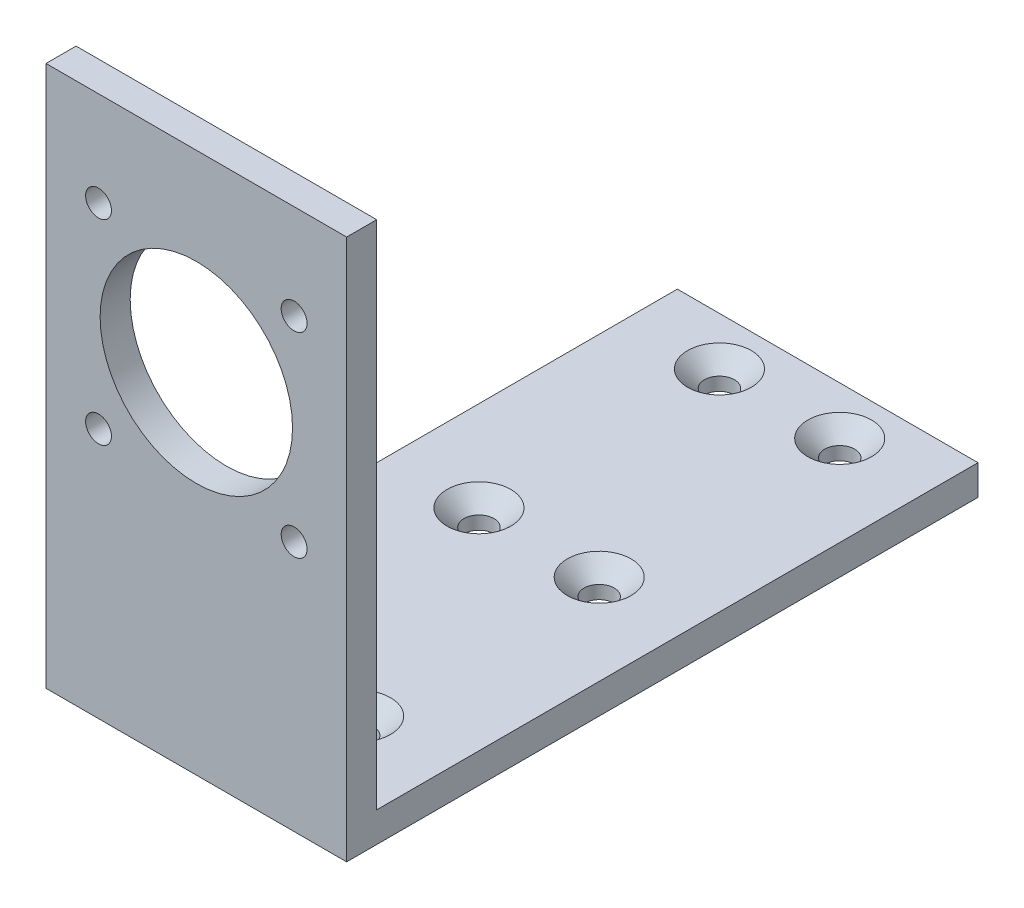
ISO-10303-21;
HEADER;
FILE_DESCRIPTION(('STEP AP214'),'2;1');
FILE_NAME('part.step','',(''),(''),'','','');
FILE_SCHEMA(('AUTOMOTIVE_DESIGN { 1 0 10303 214 1 1 1 1 }'));
ENDSEC;
DATA;
#1=APPLICATION_CONTEXT('core data for automotive mechanical design processes');
#2=APPLICATION_PROTOCOL_DEFINITION('international standard','automotive_design',2000,#1);
#3=PRODUCT_CONTEXT('',#1,'mechanical');
#4=PRODUCT('Part','Part','',(#3));
#5=PRODUCT_RELATED_PRODUCT_CATEGORY('part','',(#4));
#6=PRODUCT_DEFINITION_FORMATION('','',#4);
#7=PRODUCT_DEFINITION_CONTEXT('part definition',#1,'design');
#8=PRODUCT_DEFINITION('design','',#6,#7);
#9=PRODUCT_DEFINITION_SHAPE('','',#8);
#10=(LENGTH_UNIT() NAMED_UNIT(*) SI_UNIT(.MILLI.,.METRE.));
#11=(NAMED_UNIT(*) PLANE_ANGLE_UNIT() SI_UNIT($,.RADIAN.));
#12=(NAMED_UNIT(*) SI_UNIT($,.STERADIAN.) SOLID_ANGLE_UNIT());
#13=UNCERTAINTY_MEASURE_WITH_UNIT(LENGTH_MEASURE(1.E-05),#10,'distance_accuracy_value','');
#14=(GEOMETRIC_REPRESENTATION_CONTEXT(3) GLOBAL_UNCERTAINTY_ASSIGNED_CONTEXT((#13)) GLOBAL_UNIT_ASSIGNED_CONTEXT((#10,
#11,#12)) REPRESENTATION_CONTEXT('',''));
#15=CARTESIAN_POINT('',(0.,0.,0.));
#16=DIRECTION('',(0.,0.,1.));
#17=DIRECTION('',(1.,0.,0.));
#18=AXIS2_PLACEMENT_3D('',#15,#16,#17);
#19=CARTESIAN_POINT('',(0.,0.,0.));
#20=DIRECTION('',(0.,0.,1.));
#21=DIRECTION('',(1.,0.,0.));
#22=AXIS2_PLACEMENT_3D('',#19,#20,#21);
#23=PLANE('',#22);
#24=CARTESIAN_POINT('',(-16.2634559672906,-3.26345596729062,0.));
#25=DIRECTION('',(0.,0.,1.));
#26=DIRECTION('',(1.,0.,0.));
#27=AXIS2_PLACEMENT_3D('',#24,#25,#26);
#28=CIRCLE('',#27,2.15);
#29=CARTESIAN_POINT('',(-14.1134559672906,-3.26345596729062,0.));
#30=VERTEX_POINT('',#29);
#31=EDGE_CURVE('E144',#30,#30,#28,.T.);
#32=ORIENTED_EDGE('',*,*,#31,.T.);
#33=EDGE_LOOP('',(#32));
#34=FACE_BOUND('',#33,.T.);
#35=CARTESIAN_POINT('',(16.2634559672906,29.2634559672906,0.));
#36=DIRECTION('',(0.,0.,1.));
#37=DIRECTION('',(1.,0.,0.));
#38=AXIS2_PLACEMENT_3D('',#35,#36,#37);
#39=CIRCLE('',#38,2.15);
#40=CARTESIAN_POINT('',(18.4134559672906,29.2634559672906,0.));
#41=VERTEX_POINT('',#40);
#42=EDGE_CURVE('E349',#41,#41,#39,.T.);
#43=ORIENTED_EDGE('',*,*,#42,.T.);
#44=EDGE_LOOP('',(#43));
#45=FACE_BOUND('',#44,.T.);
#46=CARTESIAN_POINT('',(0.,13.,0.));
#47=DIRECTION('',(0.,0.,1.));
#48=DIRECTION('',(1.,0.,0.));
#49=AXIS2_PLACEMENT_3D('',#46,#47,#48);
#50=CIRCLE('',#49,16.);
#51=CARTESIAN_POINT('',(16.,13.,0.));
#52=VERTEX_POINT('',#51);
#53=EDGE_CURVE('E308',#52,#52,#50,.T.);
#54=ORIENTED_EDGE('',*,*,#53,.T.);
#55=EDGE_LOOP('',(#54));
#56=FACE_BOUND('',#55,.T.);
#57=CARTESIAN_POINT('',(-16.2634559672906,29.2634559672906,0.));
#58=DIRECTION('',(0.,0.,1.));
#59=DIRECTION('',(1.,0.,0.));
#60=AXIS2_PLACEMENT_3D('',#57,#58,#59);
#61=CIRCLE('',#60,2.15);
#62=CARTESIAN_POINT('',(-14.1134559672906,29.2634559672906,0.));
#63=VERTEX_POINT('',#62);
#64=EDGE_CURVE('E315',#63,#63,#61,.T.);
#65=ORIENTED_EDGE('',*,*,#64,.T.);
#66=EDGE_LOOP('',(#65));
#67=FACE_BOUND('',#66,.T.);
#68=CARTESIAN_POINT('',(16.2634559672906,-3.26345596729055,0.));
#69=DIRECTION('',(0.,0.,1.));
#70=DIRECTION('',(1.,0.,0.));
#71=AXIS2_PLACEMENT_3D('',#68,#69,#70);
#72=CIRCLE('',#71,2.15);
#73=CARTESIAN_POINT('',(18.4134559672906,-3.26345596729055,0.));
#74=VERTEX_POINT('',#73);
#75=EDGE_CURVE('E342',#74,#74,#72,.T.);
#76=ORIENTED_EDGE('',*,*,#75,.T.);
#77=EDGE_LOOP('',(#76));
#78=FACE_BOUND('',#77,.T.);
#79=DIRECTION('',(1.,0.,0.));
#80=VECTOR('',#79,1.);
#81=CARTESIAN_POINT('',(25.,-40.,0.));
#82=LINE('',#81,#80);
#83=CARTESIAN_POINT('',(-25.,-40.,0.));
#84=VERTEX_POINT('',#83);
#85=CARTESIAN_POINT('',(25.,-40.,0.));
#86=VERTEX_POINT('',#85);
#87=EDGE_CURVE('E50',#84,#86,#82,.T.);
#88=ORIENTED_EDGE('',*,*,#87,.F.);
#89=DIRECTION('',(0.,-1.,0.));
#90=VECTOR('',#89,1.);
#91=CARTESIAN_POINT('',(-25.,45.,0.));
#92=LINE('',#91,#90);
#93=CARTESIAN_POINT('',(-25.,45.,0.));
#94=VERTEX_POINT('',#93);
#95=EDGE_CURVE('E135',#94,#84,#92,.T.);
#96=ORIENTED_EDGE('',*,*,#95,.F.);
#97=DIRECTION('',(-1.,0.,0.));
#98=VECTOR('',#97,1.);
#99=CARTESIAN_POINT('',(-25.,45.,0.));
#100=LINE('',#99,#98);
#101=CARTESIAN_POINT('',(25.,45.,0.));
#102=VERTEX_POINT('',#101);
#103=EDGE_CURVE('E75',#102,#94,#100,.T.);
#104=ORIENTED_EDGE('',*,*,#103,.F.);
#105=DIRECTION('',(0.,1.,0.));
#106=VECTOR('',#105,1.);
#107=CARTESIAN_POINT('',(25.,45.,0.));
#108=LINE('',#107,#106);
#109=EDGE_CURVE('E312',#86,#102,#108,.T.);
#110=ORIENTED_EDGE('',*,*,#109,.F.);
#111=EDGE_LOOP('',(#88,#96,#104,#110));
#112=FACE_BOUND('',#111,.T.);
#113=ADVANCED_FACE('F35',(#34,#45,#56,#67,#78,#112),#23,.F.);
#114=CARTESIAN_POINT('',(0.,0.,5.));
#115=DIRECTION('',(0.,0.,1.));
#116=DIRECTION('',(1.,0.,0.));
#117=AXIS2_PLACEMENT_3D('',#114,#115,#116);
#118=PLANE('',#117);
#119=CARTESIAN_POINT('',(16.2634559672906,-3.26345596729055,5.));
#120=DIRECTION('',(0.,0.,1.));
#121=DIRECTION('',(1.,0.,0.));
#122=AXIS2_PLACEMENT_3D('',#119,#120,#121);
#123=CIRCLE('',#122,2.15);
#124=CARTESIAN_POINT('',(18.4134559672906,-3.26345596729055,5.));
#125=VERTEX_POINT('',#124);
#126=EDGE_CURVE('E344',#125,#125,#123,.T.);
#127=ORIENTED_EDGE('',*,*,#126,.F.);
#128=EDGE_LOOP('',(#127));
#129=FACE_BOUND('',#128,.T.);
#130=CARTESIAN_POINT('',(-16.2634559672906,29.2634559672906,5.));
#131=DIRECTION('',(0.,0.,1.));
#132=DIRECTION('',(1.,0.,0.));
#133=AXIS2_PLACEMENT_3D('',#130,#131,#132);
#134=CIRCLE('',#133,2.15);
#135=CARTESIAN_POINT('',(-14.1134559672906,29.2634559672906,5.));
#136=VERTEX_POINT('',#135);
#137=EDGE_CURVE('E310',#136,#136,#134,.T.);
#138=ORIENTED_EDGE('',*,*,#137,.F.);
#139=EDGE_LOOP('',(#138));
#140=FACE_BOUND('',#139,.T.);
#141=DIRECTION('',(0.,1.,0.));
#142=VECTOR('',#141,1.);
#143=CARTESIAN_POINT('',(25.,45.,5.));
#144=LINE('',#143,#142);
#145=CARTESIAN_POINT('',(25.,-45.,5.));
#146=VERTEX_POINT('',#145);
#147=CARTESIAN_POINT('',(25.,45.,5.));
#148=VERTEX_POINT('',#147);
#149=EDGE_CURVE('E104',#146,#148,#144,.T.);
#150=ORIENTED_EDGE('',*,*,#149,.T.);
#151=DIRECTION('',(-1.,0.,0.));
#152=VECTOR('',#151,1.);
#153=CARTESIAN_POINT('',(-25.,45.,5.));
#154=LINE('',#153,#152);
#155=CARTESIAN_POINT('',(-25.,45.,5.));
#156=VERTEX_POINT('',#155);
#157=EDGE_CURVE('E80',#148,#156,#154,.T.);
#158=ORIENTED_EDGE('',*,*,#157,.T.);
#159=DIRECTION('',(0.,-1.,0.));
#160=VECTOR('',#159,1.);
#161=CARTESIAN_POINT('',(-25.,45.,5.));
#162=LINE('',#161,#160);
#163=CARTESIAN_POINT('',(-25.,-45.,5.));
#164=VERTEX_POINT('',#163);
#165=EDGE_CURVE('E321',#156,#164,#162,.T.);
#166=ORIENTED_EDGE('',*,*,#165,.T.);
#167=DIRECTION('',(1.,0.,0.));
#168=VECTOR('',#167,1.);
#169=CARTESIAN_POINT('',(-25.,-45.,5.));
#170=LINE('',#169,#168);
#171=EDGE_CURVE('E59',#164,#146,#170,.T.);
#172=ORIENTED_EDGE('',*,*,#171,.T.);
#173=EDGE_LOOP('',(#150,#158,#166,#172));
#174=FACE_BOUND('',#173,.T.);
#175=CARTESIAN_POINT('',(0.,13.,5.));
#176=DIRECTION('',(0.,0.,1.));
#177=DIRECTION('',(1.,0.,0.));
#178=AXIS2_PLACEMENT_3D('',#175,#176,#177);
#179=CIRCLE('',#178,16.);
#180=CARTESIAN_POINT('',(16.,13.,5.));
#181=VERTEX_POINT('',#180);
#182=EDGE_CURVE('E305',#181,#181,#179,.T.);
#183=ORIENTED_EDGE('',*,*,#182,.F.);
#184=EDGE_LOOP('',(#183));
#185=FACE_BOUND('',#184,.T.);
#186=CARTESIAN_POINT('',(16.2634559672906,29.2634559672906,5.));
#187=DIRECTION('',(0.,0.,1.));
#188=DIRECTION('',(1.,0.,0.));
#189=AXIS2_PLACEMENT_3D('',#186,#187,#188);
#190=CIRCLE('',#189,2.15);
#191=CARTESIAN_POINT('',(18.4134559672906,29.2634559672906,5.));
#192=VERTEX_POINT('',#191);
#193=EDGE_CURVE('E339',#192,#192,#190,.T.);
#194=ORIENTED_EDGE('',*,*,#193,.F.);
#195=EDGE_LOOP('',(#194));
#196=FACE_BOUND('',#195,.T.);
#197=CARTESIAN_POINT('',(-16.2634559672906,-3.26345596729062,5.));
#198=DIRECTION('',(0.,0.,1.));
#199=DIRECTION('',(1.,0.,0.));
#200=AXIS2_PLACEMENT_3D('',#197,#198,#199);
#201=CIRCLE('',#200,2.15);
#202=CARTESIAN_POINT('',(-14.1134559672906,-3.26345596729062,5.));
#203=VERTEX_POINT('',#202);
#204=EDGE_CURVE('E131',#203,#203,#201,.T.);
#205=ORIENTED_EDGE('',*,*,#204,.F.);
#206=EDGE_LOOP('',(#205));
#207=FACE_BOUND('',#206,.T.);
#208=ADVANCED_FACE('F197',(#129,#140,#174,#185,#196,#207),#118,.T.);
#209=CARTESIAN_POINT('',(25.,45.,5.));
#210=DIRECTION('',(-1.,0.,0.));
#211=DIRECTION('',(0.,-1.,0.));
#212=AXIS2_PLACEMENT_3D('',#209,#210,#211);
#213=PLANE('',#212);
#214=DIRECTION('',(0.,0.,-1.));
#215=VECTOR('',#214,1.);
#216=CARTESIAN_POINT('',(25.,-45.,5.));
#217=LINE('',#216,#215);
#218=CARTESIAN_POINT('',(25.,-45.,-100.));
#219=VERTEX_POINT('',#218);
#220=EDGE_CURVE('E97',#146,#219,#217,.T.);
#221=ORIENTED_EDGE('',*,*,#220,.T.);
#222=DIRECTION('',(0.,-1.,0.));
#223=VECTOR('',#222,1.);
#224=CARTESIAN_POINT('',(25.,-45.,-100.));
#225=LINE('',#224,#223);
#226=CARTESIAN_POINT('',(25.,-40.,-100.));
#227=VERTEX_POINT('',#226);
#228=EDGE_CURVE('E102',#227,#219,#225,.T.);
#229=ORIENTED_EDGE('',*,*,#228,.F.);
#230=DIRECTION('',(0.,0.,1.));
#231=VECTOR('',#230,1.);
#232=CARTESIAN_POINT('',(25.,-40.,-100.));
#233=LINE('',#232,#231);
#234=EDGE_CURVE('E128',#227,#86,#233,.T.);
#235=ORIENTED_EDGE('',*,*,#234,.T.);
#236=ORIENTED_EDGE('',*,*,#109,.T.);
#237=DIRECTION('',(0.,0.,-1.));
#238=VECTOR('',#237,1.);
#239=CARTESIAN_POINT('',(25.,45.,5.));
#240=LINE('',#239,#238);
#241=EDGE_CURVE('E151',#148,#102,#240,.T.);
#242=ORIENTED_EDGE('',*,*,#241,.F.);
#243=ORIENTED_EDGE('',*,*,#149,.F.);
#244=EDGE_LOOP('',(#221,#229,#235,#236,#242,#243));
#245=FACE_BOUND('',#244,.T.);
#246=ADVANCED_FACE('F99',(#245),#213,.F.);
#247=CARTESIAN_POINT('',(-25.,45.,5.));
#248=DIRECTION('',(0.,-1.,0.));
#249=DIRECTION('',(0.,0.,-1.));
#250=AXIS2_PLACEMENT_3D('',#247,#248,#249);
#251=PLANE('',#250);
#252=ORIENTED_EDGE('',*,*,#103,.T.);
#253=DIRECTION('',(0.,0.,-1.));
#254=VECTOR('',#253,1.);
#255=CARTESIAN_POINT('',(-25.,45.,5.));
#256=LINE('',#255,#254);
#257=EDGE_CURVE('E328',#156,#94,#256,.T.);
#258=ORIENTED_EDGE('',*,*,#257,.F.);
#259=ORIENTED_EDGE('',*,*,#157,.F.);
#260=ORIENTED_EDGE('',*,*,#241,.T.);
#261=EDGE_LOOP('',(#252,#258,#259,#260));
#262=FACE_BOUND('',#261,.T.);
#263=ADVANCED_FACE('F216',(#262),#251,.F.);
#264=CARTESIAN_POINT('',(-25.,45.,5.));
#265=DIRECTION('',(1.,0.,0.));
#266=DIRECTION('',(0.,1.,0.));
#267=AXIS2_PLACEMENT_3D('',#264,#265,#266);
#268=PLANE('',#267);
#269=ORIENTED_EDGE('',*,*,#95,.T.);
#270=DIRECTION('',(0.,0.,1.));
#271=VECTOR('',#270,1.);
#272=CARTESIAN_POINT('',(-25.,-40.,-100.));
#273=LINE('',#272,#271);
#274=CARTESIAN_POINT('',(-25.,-40.,-100.));
#275=VERTEX_POINT('',#274);
#276=EDGE_CURVE('E139',#275,#84,#273,.T.);
#277=ORIENTED_EDGE('',*,*,#276,.F.);
#278=DIRECTION('',(0.,1.,0.));
#279=VECTOR('',#278,1.);
#280=CARTESIAN_POINT('',(-25.,-40.,-100.));
#281=LINE('',#280,#279);
#282=CARTESIAN_POINT('',(-25.,-45.,-100.));
#283=VERTEX_POINT('',#282);
#284=EDGE_CURVE('E114',#283,#275,#281,.T.);
#285=ORIENTED_EDGE('',*,*,#284,.F.);
#286=DIRECTION('',(0.,0.,-1.));
#287=VECTOR('',#286,1.);
#288=CARTESIAN_POINT('',(-25.,-45.,5.));
#289=LINE('',#288,#287);
#290=EDGE_CURVE('E106',#164,#283,#289,.T.);
#291=ORIENTED_EDGE('',*,*,#290,.F.);
#292=ORIENTED_EDGE('',*,*,#165,.F.);
#293=ORIENTED_EDGE('',*,*,#257,.T.);
#294=EDGE_LOOP('',(#269,#277,#285,#291,#292,#293));
#295=FACE_BOUND('',#294,.T.);
#296=ADVANCED_FACE('F212',(#295),#268,.F.);
#297=CARTESIAN_POINT('',(-25.,-45.,5.));
#298=DIRECTION('',(0.,1.,0.));
#299=DIRECTION('',(0.,0.,1.));
#300=AXIS2_PLACEMENT_3D('',#297,#298,#299);
#301=PLANE('',#300);
#302=CARTESIAN_POINT('',(9.99999999999999,-45.,-52.0022930035217));
#303=DIRECTION('',(0.,1.,0.));
#304=DIRECTION('',(-1.,0.,0.));
#305=AXIS2_PLACEMENT_3D('',#302,#303,#304);
#306=CIRCLE('',#305,2.5);
#307=CARTESIAN_POINT('',(7.49999999999999,-45.,-52.0022930035217));
#308=VERTEX_POINT('',#307);
#309=EDGE_CURVE('E249',#308,#308,#306,.T.);
#310=ORIENTED_EDGE('',*,*,#309,.T.);
#311=EDGE_LOOP('',(#310));
#312=FACE_BOUND('',#311,.T.);
#313=CARTESIAN_POINT('',(-10.,-45.,-52.0022930035217));
#314=DIRECTION('',(0.,1.,0.));
#315=DIRECTION('',(-1.,0.,0.));
#316=AXIS2_PLACEMENT_3D('',#313,#314,#315);
#317=CIRCLE('',#316,2.5);
#318=CARTESIAN_POINT('',(-12.5,-45.,-52.0022930035217));
#319=VERTEX_POINT('',#318);
#320=EDGE_CURVE('E246',#319,#319,#317,.T.);
#321=ORIENTED_EDGE('',*,*,#320,.T.);
#322=EDGE_LOOP('',(#321));
#323=FACE_BOUND('',#322,.T.);
#324=CARTESIAN_POINT('',(9.99999999999999,-45.,-12.0022930035217));
#325=DIRECTION('',(0.,1.,0.));
#326=DIRECTION('',(-1.,0.,0.));
#327=AXIS2_PLACEMENT_3D('',#324,#325,#326);
#328=CIRCLE('',#327,2.5);
#329=CARTESIAN_POINT('',(7.49999999999999,-45.,-12.0022930035217));
#330=VERTEX_POINT('',#329);
#331=EDGE_CURVE('E248',#330,#330,#328,.T.);
#332=ORIENTED_EDGE('',*,*,#331,.T.);
#333=EDGE_LOOP('',(#332));
#334=FACE_BOUND('',#333,.T.);
#335=CARTESIAN_POINT('',(-10.,-45.,-12.0022930035217));
#336=DIRECTION('',(0.,1.,0.));
#337=DIRECTION('',(-1.,0.,0.));
#338=AXIS2_PLACEMENT_3D('',#335,#336,#337);
#339=CIRCLE('',#338,2.5);
#340=CARTESIAN_POINT('',(-12.5,-45.,-12.0022930035217));
#341=VERTEX_POINT('',#340);
#342=EDGE_CURVE('E252',#341,#341,#339,.T.);
#343=ORIENTED_EDGE('',*,*,#342,.T.);
#344=EDGE_LOOP('',(#343));
#345=FACE_BOUND('',#344,.T.);
#346=CARTESIAN_POINT('',(9.99999999999999,-45.,-92.0022930035217));
#347=DIRECTION('',(0.,1.,0.));
#348=DIRECTION('',(-1.,0.,0.));
#349=AXIS2_PLACEMENT_3D('',#346,#347,#348);
#350=CIRCLE('',#349,2.5);
#351=CARTESIAN_POINT('',(7.49999999999999,-45.,-92.0022930035217));
#352=VERTEX_POINT('',#351);
#353=EDGE_CURVE('E258',#352,#352,#350,.T.);
#354=ORIENTED_EDGE('',*,*,#353,.T.);
#355=EDGE_LOOP('',(#354));
#356=FACE_BOUND('',#355,.T.);
#357=CARTESIAN_POINT('',(-10.,-45.,-92.0022930035217));
#358=DIRECTION('',(0.,1.,0.));
#359=DIRECTION('',(-1.,0.,0.));
#360=AXIS2_PLACEMENT_3D('',#357,#358,#359);
#361=CIRCLE('',#360,2.5);
#362=CARTESIAN_POINT('',(-12.5,-45.,-92.0022930035217));
#363=VERTEX_POINT('',#362);
#364=EDGE_CURVE('E121',#363,#363,#361,.T.);
#365=ORIENTED_EDGE('',*,*,#364,.T.);
#366=EDGE_LOOP('',(#365));
#367=FACE_BOUND('',#366,.T.);
#368=ORIENTED_EDGE('',*,*,#290,.T.);
#369=DIRECTION('',(-1.,0.,0.));
#370=VECTOR('',#369,1.);
#371=CARTESIAN_POINT('',(-25.,-45.,-100.));
#372=LINE('',#371,#370);
#373=EDGE_CURVE('E109',#219,#283,#372,.T.);
#374=ORIENTED_EDGE('',*,*,#373,.F.);
#375=ORIENTED_EDGE('',*,*,#220,.F.);
#376=ORIENTED_EDGE('',*,*,#171,.F.);
#377=EDGE_LOOP('',(#368,#374,#375,#376));
#378=FACE_BOUND('',#377,.T.);
#379=ADVANCED_FACE('F110',(#312,#323,#334,#345,#356,#367,#378),#301,.F.);
#380=CARTESIAN_POINT('',(0.,13.,5.));
#381=DIRECTION('',(0.,0.,-1.));
#382=DIRECTION('',(-1.,0.,0.));
#383=AXIS2_PLACEMENT_3D('',#380,#381,#382);
#384=CYLINDRICAL_SURFACE('',#383,16.);
#385=ORIENTED_EDGE('',*,*,#182,.T.);
#386=EDGE_LOOP('',(#385));
#387=FACE_BOUND('',#386,.T.);
#388=ORIENTED_EDGE('',*,*,#53,.F.);
#389=EDGE_LOOP('',(#388));
#390=FACE_BOUND('',#389,.T.);
#391=ADVANCED_FACE('F211',(#387,#390),#384,.F.);
#392=CARTESIAN_POINT('',(-16.2634559672906,29.2634559672906,5.));
#393=DIRECTION('',(0.,0.,-1.));
#394=DIRECTION('',(-1.,0.,0.));
#395=AXIS2_PLACEMENT_3D('',#392,#393,#394);
#396=CYLINDRICAL_SURFACE('',#395,2.15);
#397=ORIENTED_EDGE('',*,*,#137,.T.);
#398=EDGE_LOOP('',(#397));
#399=FACE_BOUND('',#398,.T.);
#400=ORIENTED_EDGE('',*,*,#64,.F.);
#401=EDGE_LOOP('',(#400));
#402=FACE_BOUND('',#401,.T.);
#403=ADVANCED_FACE('F294',(#399,#402),#396,.F.);
#404=CARTESIAN_POINT('',(16.2634559672906,29.2634559672906,5.));
#405=DIRECTION('',(0.,0.,-1.));
#406=DIRECTION('',(-1.,0.,0.));
#407=AXIS2_PLACEMENT_3D('',#404,#405,#406);
#408=CYLINDRICAL_SURFACE('',#407,2.15);
#409=ORIENTED_EDGE('',*,*,#193,.T.);
#410=EDGE_LOOP('',(#409));
#411=FACE_BOUND('',#410,.T.);
#412=ORIENTED_EDGE('',*,*,#42,.F.);
#413=EDGE_LOOP('',(#412));
#414=FACE_BOUND('',#413,.T.);
#415=ADVANCED_FACE('F290',(#411,#414),#408,.F.);
#416=CARTESIAN_POINT('',(16.2634559672906,-3.26345596729055,5.));
#417=DIRECTION('',(0.,0.,-1.));
#418=DIRECTION('',(-1.,0.,0.));
#419=AXIS2_PLACEMENT_3D('',#416,#417,#418);
#420=CYLINDRICAL_SURFACE('',#419,2.15);
#421=ORIENTED_EDGE('',*,*,#126,.T.);
#422=EDGE_LOOP('',(#421));
#423=FACE_BOUND('',#422,.T.);
#424=ORIENTED_EDGE('',*,*,#75,.F.);
#425=EDGE_LOOP('',(#424));
#426=FACE_BOUND('',#425,.T.);
#427=ADVANCED_FACE('F286',(#423,#426),#420,.F.);
#428=CARTESIAN_POINT('',(-16.2634559672906,-3.26345596729062,5.));
#429=DIRECTION('',(0.,0.,-1.));
#430=DIRECTION('',(-1.,0.,0.));
#431=AXIS2_PLACEMENT_3D('',#428,#429,#430);
#432=CYLINDRICAL_SURFACE('',#431,2.15);
#433=ORIENTED_EDGE('',*,*,#204,.T.);
#434=EDGE_LOOP('',(#433));
#435=FACE_BOUND('',#434,.T.);
#436=ORIENTED_EDGE('',*,*,#31,.F.);
#437=EDGE_LOOP('',(#436));
#438=FACE_BOUND('',#437,.T.);
#439=ADVANCED_FACE('F282',(#435,#438),#432,.F.);
#440=CARTESIAN_POINT('',(25.,-40.,-100.));
#441=DIRECTION('',(0.,-1.,0.));
#442=DIRECTION('',(0.,0.,-1.));
#443=AXIS2_PLACEMENT_3D('',#440,#441,#442);
#444=PLANE('',#443);
#445=CARTESIAN_POINT('',(9.99999999999999,-40.,-12.0022930035217));
#446=DIRECTION('',(0.,-1.,0.));
#447=DIRECTION('',(0.,0.,-1.));
#448=AXIS2_PLACEMENT_3D('',#445,#446,#447);
#449=CIRCLE('',#448,5.30000000000001);
#450=CARTESIAN_POINT('',(9.99999999999999,-40.,-17.3022930035217));
#451=VERTEX_POINT('',#450);
#452=EDGE_CURVE('E166',#451,#451,#449,.T.);
#453=ORIENTED_EDGE('',*,*,#452,.T.);
#454=EDGE_LOOP('',(#453));
#455=FACE_BOUND('',#454,.T.);
#456=CARTESIAN_POINT('',(-10.,-40.,-12.0022930035217));
#457=DIRECTION('',(0.,-1.,0.));
#458=DIRECTION('',(0.,0.,-1.));
#459=AXIS2_PLACEMENT_3D('',#456,#457,#458);
#460=CIRCLE('',#459,5.30000000000001);
#461=CARTESIAN_POINT('',(-10.,-40.,-17.3022930035217));
#462=VERTEX_POINT('',#461);
#463=EDGE_CURVE('E163',#462,#462,#460,.T.);
#464=ORIENTED_EDGE('',*,*,#463,.T.);
#465=EDGE_LOOP('',(#464));
#466=FACE_BOUND('',#465,.T.);
#467=CARTESIAN_POINT('',(-10.,-40.,-52.0022930035217));
#468=DIRECTION('',(0.,-1.,0.));
#469=DIRECTION('',(0.,0.,-1.));
#470=AXIS2_PLACEMENT_3D('',#467,#468,#469);
#471=CIRCLE('',#470,5.3);
#472=CARTESIAN_POINT('',(-10.,-40.,-57.3022930035217));
#473=VERTEX_POINT('',#472);
#474=EDGE_CURVE('E160',#473,#473,#471,.T.);
#475=ORIENTED_EDGE('',*,*,#474,.T.);
#476=EDGE_LOOP('',(#475));
#477=FACE_BOUND('',#476,.T.);
#478=CARTESIAN_POINT('',(9.99999999999999,-40.,-52.0022930035217));
#479=DIRECTION('',(0.,-1.,0.));
#480=DIRECTION('',(0.,0.,-1.));
#481=AXIS2_PLACEMENT_3D('',#478,#479,#480);
#482=CIRCLE('',#481,5.3);
#483=CARTESIAN_POINT('',(9.99999999999999,-40.,-57.3022930035217));
#484=VERTEX_POINT('',#483);
#485=EDGE_CURVE('E157',#484,#484,#482,.T.);
#486=ORIENTED_EDGE('',*,*,#485,.T.);
#487=EDGE_LOOP('',(#486));
#488=FACE_BOUND('',#487,.T.);
#489=CARTESIAN_POINT('',(9.99999999999999,-40.,-92.0022930035217));
#490=DIRECTION('',(0.,-1.,0.));
#491=DIRECTION('',(0.,0.,-1.));
#492=AXIS2_PLACEMENT_3D('',#489,#490,#491);
#493=CIRCLE('',#492,5.3);
#494=CARTESIAN_POINT('',(9.99999999999999,-40.,-97.3022930035217));
#495=VERTEX_POINT('',#494);
#496=EDGE_CURVE('E154',#495,#495,#493,.T.);
#497=ORIENTED_EDGE('',*,*,#496,.T.);
#498=EDGE_LOOP('',(#497));
#499=FACE_BOUND('',#498,.T.);
#500=CARTESIAN_POINT('',(-10.,-40.,-92.0022930035217));
#501=DIRECTION('',(0.,-1.,0.));
#502=DIRECTION('',(0.,0.,-1.));
#503=AXIS2_PLACEMENT_3D('',#500,#501,#502);
#504=CIRCLE('',#503,5.3);
#505=CARTESIAN_POINT('',(-10.,-40.,-97.3022930035217));
#506=VERTEX_POINT('',#505);
#507=EDGE_CURVE('E150',#506,#506,#504,.T.);
#508=ORIENTED_EDGE('',*,*,#507,.T.);
#509=EDGE_LOOP('',(#508));
#510=FACE_BOUND('',#509,.T.);
#511=ORIENTED_EDGE('',*,*,#87,.T.);
#512=ORIENTED_EDGE('',*,*,#234,.F.);
#513=DIRECTION('',(1.,0.,0.));
#514=VECTOR('',#513,1.);
#515=CARTESIAN_POINT('',(25.,-40.,-100.));
#516=LINE('',#515,#514);
#517=EDGE_CURVE('E118',#275,#227,#516,.T.);
#518=ORIENTED_EDGE('',*,*,#517,.F.);
#519=ORIENTED_EDGE('',*,*,#276,.T.);
#520=EDGE_LOOP('',(#511,#512,#518,#519));
#521=FACE_BOUND('',#520,.T.);
#522=ADVANCED_FACE('F276',(#455,#466,#477,#488,#499,#510,#521),#444,.F.);
#523=CARTESIAN_POINT('',(0.,0.,-100.));
#524=DIRECTION('',(0.,0.,1.));
#525=DIRECTION('',(1.,0.,0.));
#526=AXIS2_PLACEMENT_3D('',#523,#524,#525);
#527=PLANE('',#526);
#528=ORIENTED_EDGE('',*,*,#228,.T.);
#529=ORIENTED_EDGE('',*,*,#373,.T.);
#530=ORIENTED_EDGE('',*,*,#284,.T.);
#531=ORIENTED_EDGE('',*,*,#517,.T.);
#532=EDGE_LOOP('',(#528,#529,#530,#531));
#533=FACE_BOUND('',#532,.T.);
#534=ADVANCED_FACE('F116',(#533),#527,.F.);
#535=CARTESIAN_POINT('',(-10.,-45.,-92.0022930035217));
#536=DIRECTION('',(0.,1.,0.));
#537=DIRECTION('',(-1.,0.,0.));
#538=AXIS2_PLACEMENT_3D('',#535,#536,#537);
#539=CYLINDRICAL_SURFACE('',#538,2.5);
#540=CARTESIAN_POINT('',(-10.,-42.8,-92.0022930035217));
#541=DIRECTION('',(0.,-1.,0.));
#542=DIRECTION('',(0.,0.,-1.));
#543=AXIS2_PLACEMENT_3D('',#540,#541,#542);
#544=CIRCLE('',#543,2.5);
#545=CARTESIAN_POINT('',(-10.,-42.8,-94.5022930035217));
#546=VERTEX_POINT('',#545);
#547=EDGE_CURVE('E11',#546,#546,#544,.F.);
#548=ORIENTED_EDGE('',*,*,#547,.T.);
#549=EDGE_LOOP('',(#548));
#550=FACE_BOUND('',#549,.T.);
#551=ORIENTED_EDGE('',*,*,#364,.F.);
#552=EDGE_LOOP('',(#551));
#553=FACE_BOUND('',#552,.T.);
#554=ADVANCED_FACE('F266',(#550,#553),#539,.F.);
#555=CARTESIAN_POINT('',(9.99999999999999,-45.,-92.0022930035217));
#556=DIRECTION('',(0.,1.,0.));
#557=DIRECTION('',(-1.,0.,0.));
#558=AXIS2_PLACEMENT_3D('',#555,#556,#557);
#559=CYLINDRICAL_SURFACE('',#558,2.5);
#560=CARTESIAN_POINT('',(9.99999999999999,-42.8,-92.0022930035217));
#561=DIRECTION('',(0.,-1.,0.));
#562=DIRECTION('',(0.,0.,-1.));
#563=AXIS2_PLACEMENT_3D('',#560,#561,#562);
#564=CIRCLE('',#563,2.5);
#565=CARTESIAN_POINT('',(9.99999999999999,-42.8,-94.5022930035217));
#566=VERTEX_POINT('',#565);
#567=EDGE_CURVE('E43',#566,#566,#564,.F.);
#568=ORIENTED_EDGE('',*,*,#567,.T.);
#569=EDGE_LOOP('',(#568));
#570=FACE_BOUND('',#569,.T.);
#571=ORIENTED_EDGE('',*,*,#353,.F.);
#572=EDGE_LOOP('',(#571));
#573=FACE_BOUND('',#572,.T.);
#574=ADVANCED_FACE('F180',(#570,#573),#559,.F.);
#575=CARTESIAN_POINT('',(-10.,-45.,-12.0022930035217));
#576=DIRECTION('',(0.,1.,0.));
#577=DIRECTION('',(-1.,0.,0.));
#578=AXIS2_PLACEMENT_3D('',#575,#576,#577);
#579=CYLINDRICAL_SURFACE('',#578,2.5);
#580=CARTESIAN_POINT('',(-10.,-42.8,-12.0022930035217));
#581=DIRECTION('',(0.,-1.,0.));
#582=DIRECTION('',(0.,0.,-1.));
#583=AXIS2_PLACEMENT_3D('',#580,#581,#582);
#584=CIRCLE('',#583,2.5);
#585=CARTESIAN_POINT('',(-10.,-42.8,-14.5022930035217));
#586=VERTEX_POINT('',#585);
#587=EDGE_CURVE('E169',#586,#586,#584,.F.);
#588=ORIENTED_EDGE('',*,*,#587,.T.);
#589=EDGE_LOOP('',(#588));
#590=FACE_BOUND('',#589,.T.);
#591=ORIENTED_EDGE('',*,*,#342,.F.);
#592=EDGE_LOOP('',(#591));
#593=FACE_BOUND('',#592,.T.);
#594=ADVANCED_FACE('F274',(#590,#593),#579,.F.);
#595=CARTESIAN_POINT('',(9.99999999999999,-45.,-12.0022930035217));
#596=DIRECTION('',(0.,1.,0.));
#597=DIRECTION('',(-1.,0.,0.));
#598=AXIS2_PLACEMENT_3D('',#595,#596,#597);
#599=CYLINDRICAL_SURFACE('',#598,2.5);
#600=CARTESIAN_POINT('',(9.99999999999999,-42.8,-12.0022930035217));
#601=DIRECTION('',(0.,-1.,0.));
#602=DIRECTION('',(0.,0.,-1.));
#603=AXIS2_PLACEMENT_3D('',#600,#601,#602);
#604=CIRCLE('',#603,2.5);
#605=CARTESIAN_POINT('',(9.99999999999999,-42.8,-14.5022930035217));
#606=VERTEX_POINT('',#605);
#607=EDGE_CURVE('E147',#606,#606,#604,.F.);
#608=ORIENTED_EDGE('',*,*,#607,.T.);
#609=EDGE_LOOP('',(#608));
#610=FACE_BOUND('',#609,.T.);
#611=ORIENTED_EDGE('',*,*,#331,.F.);
#612=EDGE_LOOP('',(#611));
#613=FACE_BOUND('',#612,.T.);
#614=ADVANCED_FACE('F242',(#610,#613),#599,.F.);
#615=CARTESIAN_POINT('',(-10.,-45.,-52.0022930035217));
#616=DIRECTION('',(0.,1.,0.));
#617=DIRECTION('',(-1.,0.,0.));
#618=AXIS2_PLACEMENT_3D('',#615,#616,#617);
#619=CYLINDRICAL_SURFACE('',#618,2.5);
#620=CARTESIAN_POINT('',(-10.,-42.8,-52.0022930035217));
#621=DIRECTION('',(0.,-1.,0.));
#622=DIRECTION('',(0.,0.,-1.));
#623=AXIS2_PLACEMENT_3D('',#620,#621,#622);
#624=CIRCLE('',#623,2.5);
#625=CARTESIAN_POINT('',(-10.,-42.8,-54.5022930035217));
#626=VERTEX_POINT('',#625);
#627=EDGE_CURVE('E172',#626,#626,#624,.F.);
#628=ORIENTED_EDGE('',*,*,#627,.T.);
#629=EDGE_LOOP('',(#628));
#630=FACE_BOUND('',#629,.T.);
#631=ORIENTED_EDGE('',*,*,#320,.F.);
#632=EDGE_LOOP('',(#631));
#633=FACE_BOUND('',#632,.T.);
#634=ADVANCED_FACE('F239',(#630,#633),#619,.F.);
#635=CARTESIAN_POINT('',(9.99999999999999,-45.,-52.0022930035217));
#636=DIRECTION('',(0.,1.,0.));
#637=DIRECTION('',(-1.,0.,0.));
#638=AXIS2_PLACEMENT_3D('',#635,#636,#637);
#639=CYLINDRICAL_SURFACE('',#638,2.5);
#640=CARTESIAN_POINT('',(9.99999999999999,-42.8,-52.0022930035217));
#641=DIRECTION('',(0.,-1.,0.));
#642=DIRECTION('',(0.,0.,-1.));
#643=AXIS2_PLACEMENT_3D('',#640,#641,#642);
#644=CIRCLE('',#643,2.5);
#645=CARTESIAN_POINT('',(9.99999999999999,-42.8,-54.5022930035217));
#646=VERTEX_POINT('',#645);
#647=EDGE_CURVE('E175',#646,#646,#644,.F.);
#648=ORIENTED_EDGE('',*,*,#647,.T.);
#649=EDGE_LOOP('',(#648));
#650=FACE_BOUND('',#649,.T.);
#651=ORIENTED_EDGE('',*,*,#309,.F.);
#652=EDGE_LOOP('',(#651));
#653=FACE_BOUND('',#652,.T.);
#654=ADVANCED_FACE('F226',(#650,#653),#639,.F.);
#655=CARTESIAN_POINT('',(9.99999999999999,-42.8,-12.0022930035217));
#656=DIRECTION('',(0.,1.,0.));
#657=DIRECTION('',(0.,0.,1.));
#658=AXIS2_PLACEMENT_3D('',#655,#656,#657);
#659=CONICAL_SURFACE('',#658,2.5,0.785398163397447);
#660=ORIENTED_EDGE('',*,*,#452,.F.);
#661=EDGE_LOOP('',(#660));
#662=FACE_BOUND('',#661,.T.);
#663=ORIENTED_EDGE('',*,*,#607,.F.);
#664=EDGE_LOOP('',(#663));
#665=FACE_BOUND('',#664,.T.);
#666=ADVANCED_FACE('F222',(#662,#665),#659,.F.);
#667=CARTESIAN_POINT('',(-10.,-42.8,-12.0022930035217));
#668=DIRECTION('',(0.,1.,0.));
#669=DIRECTION('',(0.,0.,1.));
#670=AXIS2_PLACEMENT_3D('',#667,#668,#669);
#671=CONICAL_SURFACE('',#670,2.5,0.785398163397447);
#672=ORIENTED_EDGE('',*,*,#463,.F.);
#673=EDGE_LOOP('',(#672));
#674=FACE_BOUND('',#673,.T.);
#675=ORIENTED_EDGE('',*,*,#587,.F.);
#676=EDGE_LOOP('',(#675));
#677=FACE_BOUND('',#676,.T.);
#678=ADVANCED_FACE('F225',(#674,#677),#671,.F.);
#679=CARTESIAN_POINT('',(-10.,-42.8,-52.0022930035217));
#680=DIRECTION('',(0.,1.,0.));
#681=DIRECTION('',(0.,0.,1.));
#682=AXIS2_PLACEMENT_3D('',#679,#680,#681);
#683=CONICAL_SURFACE('',#682,2.5,0.78539816339745);
#684=ORIENTED_EDGE('',*,*,#474,.F.);
#685=EDGE_LOOP('',(#684));
#686=FACE_BOUND('',#685,.T.);
#687=ORIENTED_EDGE('',*,*,#627,.F.);
#688=EDGE_LOOP('',(#687));
#689=FACE_BOUND('',#688,.T.);
#690=ADVANCED_FACE('F192',(#686,#689),#683,.F.);
#691=CARTESIAN_POINT('',(9.99999999999999,-42.8,-52.0022930035217));
#692=DIRECTION('',(0.,1.,0.));
#693=DIRECTION('',(0.,0.,1.));
#694=AXIS2_PLACEMENT_3D('',#691,#692,#693);
#695=CONICAL_SURFACE('',#694,2.5,0.78539816339745);
#696=ORIENTED_EDGE('',*,*,#485,.F.);
#697=EDGE_LOOP('',(#696));
#698=FACE_BOUND('',#697,.T.);
#699=ORIENTED_EDGE('',*,*,#647,.F.);
#700=EDGE_LOOP('',(#699));
#701=FACE_BOUND('',#700,.T.);
#702=ADVANCED_FACE('F185',(#698,#701),#695,.F.);
#703=CARTESIAN_POINT('',(9.99999999999999,-42.8,-92.0022930035217));
#704=DIRECTION('',(0.,1.,0.));
#705=DIRECTION('',(0.,0.,1.));
#706=AXIS2_PLACEMENT_3D('',#703,#704,#705);
#707=CONICAL_SURFACE('',#706,2.5,0.78539816339745);
#708=ORIENTED_EDGE('',*,*,#496,.F.);
#709=EDGE_LOOP('',(#708));
#710=FACE_BOUND('',#709,.T.);
#711=ORIENTED_EDGE('',*,*,#567,.F.);
#712=EDGE_LOOP('',(#711));
#713=FACE_BOUND('',#712,.T.);
#714=ADVANCED_FACE('F183',(#710,#713),#707,.F.);
#715=CARTESIAN_POINT('',(-10.,-42.8,-92.0022930035217));
#716=DIRECTION('',(0.,1.,0.));
#717=DIRECTION('',(0.,0.,1.));
#718=AXIS2_PLACEMENT_3D('',#715,#716,#717);
#719=CONICAL_SURFACE('',#718,2.5,0.78539816339745);
#720=ORIENTED_EDGE('',*,*,#507,.F.);
#721=EDGE_LOOP('',(#720));
#722=FACE_BOUND('',#721,.T.);
#723=ORIENTED_EDGE('',*,*,#547,.F.);
#724=EDGE_LOOP('',(#723));
#725=FACE_BOUND('',#724,.T.);
#726=ADVANCED_FACE('F37',(#722,#725),#719,.F.);
#727=CLOSED_SHELL('',(#113,#208,#246,#263,#296,#379,#391,#403,#415,#427,#439,#522,#534,#554,
#574,#594,#614,#634,#654,#666,#678,#690,#702,#714,#726));
#728=MANIFOLD_SOLID_BREP('B2',#727);
#729=ADVANCED_BREP_SHAPE_REPRESENTATION('',(#18,#728),#14);
#730=SHAPE_DEFINITION_REPRESENTATION(#9,#729);
ENDSEC;
END-ISO-10303-21;
